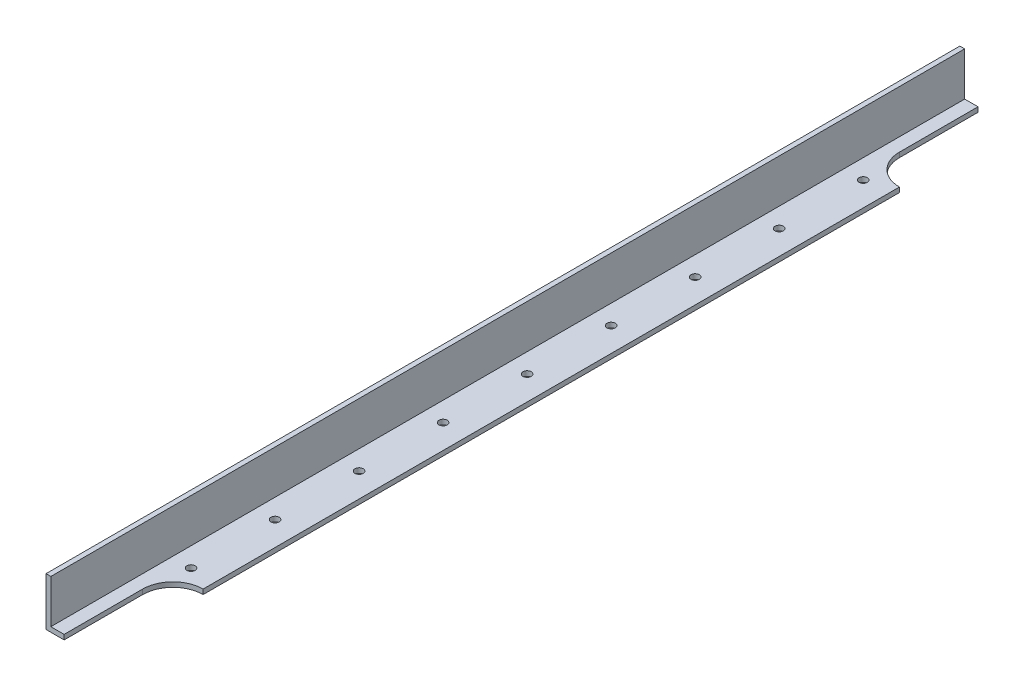
ISO-10303-21;
HEADER;
FILE_DESCRIPTION(('STEP AP214'),'2;1');
FILE_NAME('part.step','',(''),(''),'','','');
FILE_SCHEMA(('AUTOMOTIVE_DESIGN { 1 0 10303 214 1 1 1 1 }'));
ENDSEC;
DATA;
#1=APPLICATION_CONTEXT('core data for automotive mechanical design processes');
#2=APPLICATION_PROTOCOL_DEFINITION('international standard','automotive_design',2000,#1);
#3=PRODUCT_CONTEXT('',#1,'mechanical');
#4=PRODUCT('Part','Part','',(#3));
#5=PRODUCT_RELATED_PRODUCT_CATEGORY('part','',(#4));
#6=PRODUCT_DEFINITION_FORMATION('','',#4);
#7=PRODUCT_DEFINITION_CONTEXT('part definition',#1,'design');
#8=PRODUCT_DEFINITION('design','',#6,#7);
#9=PRODUCT_DEFINITION_SHAPE('','',#8);
#10=(LENGTH_UNIT() NAMED_UNIT(*) SI_UNIT(.MILLI.,.METRE.));
#11=(NAMED_UNIT(*) PLANE_ANGLE_UNIT() SI_UNIT($,.RADIAN.));
#12=(NAMED_UNIT(*) SI_UNIT($,.STERADIAN.) SOLID_ANGLE_UNIT());
#13=UNCERTAINTY_MEASURE_WITH_UNIT(LENGTH_MEASURE(1.E-05),#10,'distance_accuracy_value','');
#14=(GEOMETRIC_REPRESENTATION_CONTEXT(3) GLOBAL_UNCERTAINTY_ASSIGNED_CONTEXT((#13)) GLOBAL_UNIT_ASSIGNED_CONTEXT((#10,
#11,#12)) REPRESENTATION_CONTEXT('',''));
#15=CARTESIAN_POINT('',(0.,0.,0.));
#16=DIRECTION('',(0.,0.,1.));
#17=DIRECTION('',(1.,0.,0.));
#18=AXIS2_PLACEMENT_3D('',#15,#16,#17);
#19=CARTESIAN_POINT('',(0.,0.,378.));
#20=DIRECTION('',(0.,1.,0.));
#21=DIRECTION('',(0.,0.,1.));
#22=AXIS2_PLACEMENT_3D('',#19,#20,#21);
#23=PLANE('',#22);
#24=CARTESIAN_POINT('',(10.,0.,50.));
#25=DIRECTION('',(0.,-1.,0.));
#26=DIRECTION('',(0.,0.,-1.));
#27=AXIS2_PLACEMENT_3D('',#24,#25,#26);
#28=CIRCLE('',#27,1.7);
#29=CARTESIAN_POINT('',(10.,0.,48.3));
#30=VERTEX_POINT('',#29);
#31=EDGE_CURVE('E230',#30,#30,#28,.T.);
#32=ORIENTED_EDGE('',*,*,#31,.F.);
#33=EDGE_LOOP('',(#32));
#34=FACE_BOUND('',#33,.T.);
#35=CARTESIAN_POINT('',(9.99999999999988,0.,84.75));
#36=DIRECTION('',(0.,-1.,0.));
#37=DIRECTION('',(0.,0.,-1.));
#38=AXIS2_PLACEMENT_3D('',#35,#36,#37);
#39=CIRCLE('',#38,1.7);
#40=CARTESIAN_POINT('',(9.99999999999988,0.,83.05));
#41=VERTEX_POINT('',#40);
#42=EDGE_CURVE('E220',#41,#41,#39,.T.);
#43=ORIENTED_EDGE('',*,*,#42,.F.);
#44=EDGE_LOOP('',(#43));
#45=FACE_BOUND('',#44,.T.);
#46=CARTESIAN_POINT('',(9.99999999999976,0.,119.5));
#47=DIRECTION('',(0.,-1.,0.));
#48=DIRECTION('',(0.,0.,-1.));
#49=AXIS2_PLACEMENT_3D('',#46,#47,#48);
#50=CIRCLE('',#49,1.7);
#51=CARTESIAN_POINT('',(9.99999999999976,0.,117.8));
#52=VERTEX_POINT('',#51);
#53=EDGE_CURVE('E217',#52,#52,#50,.T.);
#54=ORIENTED_EDGE('',*,*,#53,.F.);
#55=EDGE_LOOP('',(#54));
#56=FACE_BOUND('',#55,.T.);
#57=CARTESIAN_POINT('',(9.99999999999964,0.,154.25));
#58=DIRECTION('',(0.,-1.,0.));
#59=DIRECTION('',(0.,0.,-1.));
#60=AXIS2_PLACEMENT_3D('',#57,#58,#59);
#61=CIRCLE('',#60,1.7);
#62=CARTESIAN_POINT('',(9.99999999999964,0.,152.55));
#63=VERTEX_POINT('',#62);
#64=EDGE_CURVE('E214',#63,#63,#61,.T.);
#65=ORIENTED_EDGE('',*,*,#64,.F.);
#66=EDGE_LOOP('',(#65));
#67=FACE_BOUND('',#66,.T.);
#68=CARTESIAN_POINT('',(9.99999999999952,0.,189.));
#69=DIRECTION('',(0.,-1.,0.));
#70=DIRECTION('',(0.,0.,-1.));
#71=AXIS2_PLACEMENT_3D('',#68,#69,#70);
#72=CIRCLE('',#71,1.7);
#73=CARTESIAN_POINT('',(9.99999999999952,0.,187.3));
#74=VERTEX_POINT('',#73);
#75=EDGE_CURVE('E210',#74,#74,#72,.T.);
#76=ORIENTED_EDGE('',*,*,#75,.F.);
#77=EDGE_LOOP('',(#76));
#78=FACE_BOUND('',#77,.T.);
#79=CARTESIAN_POINT('',(9.99999999999939,0.,223.75));
#80=DIRECTION('',(0.,-1.,0.));
#81=DIRECTION('',(0.,0.,-1.));
#82=AXIS2_PLACEMENT_3D('',#79,#80,#81);
#83=CIRCLE('',#82,1.7);
#84=CARTESIAN_POINT('',(9.99999999999939,0.,222.05));
#85=VERTEX_POINT('',#84);
#86=EDGE_CURVE('E206',#85,#85,#83,.T.);
#87=ORIENTED_EDGE('',*,*,#86,.F.);
#88=EDGE_LOOP('',(#87));
#89=FACE_BOUND('',#88,.T.);
#90=CARTESIAN_POINT('',(9.99999999999927,0.,258.5));
#91=DIRECTION('',(0.,-1.,0.));
#92=DIRECTION('',(0.,0.,-1.));
#93=AXIS2_PLACEMENT_3D('',#90,#91,#92);
#94=CIRCLE('',#93,1.7);
#95=CARTESIAN_POINT('',(9.99999999999927,0.,256.8));
#96=VERTEX_POINT('',#95);
#97=EDGE_CURVE('E202',#96,#96,#94,.T.);
#98=ORIENTED_EDGE('',*,*,#97,.F.);
#99=EDGE_LOOP('',(#98));
#100=FACE_BOUND('',#99,.T.);
#101=CARTESIAN_POINT('',(9.99999999999915,0.,293.25));
#102=DIRECTION('',(0.,-1.,0.));
#103=DIRECTION('',(0.,0.,-1.));
#104=AXIS2_PLACEMENT_3D('',#101,#102,#103);
#105=CIRCLE('',#104,1.7);
#106=CARTESIAN_POINT('',(9.99999999999915,0.,291.55));
#107=VERTEX_POINT('',#106);
#108=EDGE_CURVE('E198',#107,#107,#105,.T.);
#109=ORIENTED_EDGE('',*,*,#108,.F.);
#110=EDGE_LOOP('',(#109));
#111=FACE_BOUND('',#110,.T.);
#112=CARTESIAN_POINT('',(9.99999999999903,0.,328.));
#113=DIRECTION('',(0.,-1.,0.));
#114=DIRECTION('',(0.,0.,-1.));
#115=AXIS2_PLACEMENT_3D('',#112,#113,#114);
#116=CIRCLE('',#115,1.7);
#117=CARTESIAN_POINT('',(9.99999999999903,0.,326.3));
#118=VERTEX_POINT('',#117);
#119=EDGE_CURVE('E132',#118,#118,#116,.T.);
#120=ORIENTED_EDGE('',*,*,#119,.F.);
#121=EDGE_LOOP('',(#120));
#122=FACE_BOUND('',#121,.T.);
#123=DIRECTION('',(0.,0.,-1.));
#124=VECTOR('',#123,1.);
#125=CARTESIAN_POINT('',(20.,0.,378.));
#126=LINE('',#125,#124);
#127=CARTESIAN_POINT('',(20.,0.,333.));
#128=VERTEX_POINT('',#127);
#129=CARTESIAN_POINT('',(20.,0.,45.));
#130=VERTEX_POINT('',#129);
#131=EDGE_CURVE('E11',#128,#130,#126,.T.);
#132=ORIENTED_EDGE('',*,*,#131,.F.);
#133=CARTESIAN_POINT('',(20.,0.,345.5));
#134=DIRECTION('',(0.,1.,0.));
#135=DIRECTION('',(0.,0.,-1.));
#136=AXIS2_PLACEMENT_3D('',#133,#134,#135);
#137=CIRCLE('',#136,12.5000000000001);
#138=CARTESIAN_POINT('',(7.49999999999995,0.,345.5));
#139=VERTEX_POINT('',#138);
#140=EDGE_CURVE('E114',#128,#139,#137,.T.);
#141=ORIENTED_EDGE('',*,*,#140,.T.);
#142=DIRECTION('',(0.,0.,1.));
#143=VECTOR('',#142,1.);
#144=CARTESIAN_POINT('',(7.49999999999991,0.,378.));
#145=LINE('',#144,#143);
#146=CARTESIAN_POINT('',(7.49999999999991,0.,378.));
#147=VERTEX_POINT('',#146);
#148=EDGE_CURVE('E119',#139,#147,#145,.T.);
#149=ORIENTED_EDGE('',*,*,#148,.T.);
#150=DIRECTION('',(1.,0.,0.));
#151=VECTOR('',#150,1.);
#152=CARTESIAN_POINT('',(0.,0.,378.));
#153=LINE('',#152,#151);
#154=CARTESIAN_POINT('',(0.,0.,378.));
#155=VERTEX_POINT('',#154);
#156=EDGE_CURVE('E157',#155,#147,#153,.T.);
#157=ORIENTED_EDGE('',*,*,#156,.F.);
#158=DIRECTION('',(0.,0.,-1.));
#159=VECTOR('',#158,1.);
#160=CARTESIAN_POINT('',(0.,0.,378.));
#161=LINE('',#160,#159);
#162=CARTESIAN_POINT('',(0.,0.,0.));
#163=VERTEX_POINT('',#162);
#164=EDGE_CURVE('E171',#155,#163,#161,.T.);
#165=ORIENTED_EDGE('',*,*,#164,.T.);
#166=DIRECTION('',(1.,0.,0.));
#167=VECTOR('',#166,1.);
#168=CARTESIAN_POINT('',(0.,0.,0.));
#169=LINE('',#168,#167);
#170=CARTESIAN_POINT('',(7.49999999999991,0.,0.));
#171=VERTEX_POINT('',#170);
#172=EDGE_CURVE('E153',#163,#171,#169,.T.);
#173=ORIENTED_EDGE('',*,*,#172,.T.);
#174=DIRECTION('',(0.,0.,1.));
#175=VECTOR('',#174,1.);
#176=CARTESIAN_POINT('',(7.49999999999991,0.,0.));
#177=LINE('',#176,#175);
#178=CARTESIAN_POINT('',(7.49999999999991,0.,32.4999999999999));
#179=VERTEX_POINT('',#178);
#180=EDGE_CURVE('E58',#171,#179,#177,.T.);
#181=ORIENTED_EDGE('',*,*,#180,.T.);
#182=CARTESIAN_POINT('',(20.,0.,32.4999999999999));
#183=DIRECTION('',(0.,1.,0.));
#184=DIRECTION('',(0.,0.,1.));
#185=AXIS2_PLACEMENT_3D('',#182,#183,#184);
#186=CIRCLE('',#185,12.5000000000001);
#187=EDGE_CURVE('E142',#179,#130,#186,.T.);
#188=ORIENTED_EDGE('',*,*,#187,.T.);
#189=EDGE_LOOP('',(#132,#141,#149,#157,#165,#173,#181,#188));
#190=FACE_BOUND('',#189,.T.);
#191=ADVANCED_FACE('F34',(#34,#45,#56,#67,#78,#89,#100,#111,#122,#190),#23,.F.);
#192=CARTESIAN_POINT('',(20.,2.,378.));
#193=DIRECTION('',(1.,0.,0.));
#194=DIRECTION('',(0.,0.,-1.));
#195=AXIS2_PLACEMENT_3D('',#192,#193,#194);
#196=PLANE('',#195);
#197=DIRECTION('',(0.,1.,0.));
#198=VECTOR('',#197,1.);
#199=CARTESIAN_POINT('',(20.,0.,333.));
#200=LINE('',#199,#198);
#201=CARTESIAN_POINT('',(20.,2.,333.));
#202=VERTEX_POINT('',#201);
#203=EDGE_CURVE('E137',#128,#202,#200,.T.);
#204=ORIENTED_EDGE('',*,*,#203,.F.);
#205=ORIENTED_EDGE('',*,*,#131,.T.);
#206=DIRECTION('',(0.,1.,0.));
#207=VECTOR('',#206,1.);
#208=CARTESIAN_POINT('',(20.,0.,45.));
#209=LINE('',#208,#207);
#210=CARTESIAN_POINT('',(20.,2.,45.));
#211=VERTEX_POINT('',#210);
#212=EDGE_CURVE('E150',#130,#211,#209,.T.);
#213=ORIENTED_EDGE('',*,*,#212,.T.);
#214=DIRECTION('',(0.,0.,-1.));
#215=VECTOR('',#214,1.);
#216=CARTESIAN_POINT('',(20.,2.,378.));
#217=LINE('',#216,#215);
#218=EDGE_CURVE('E42',#202,#211,#217,.T.);
#219=ORIENTED_EDGE('',*,*,#218,.F.);
#220=EDGE_LOOP('',(#204,#205,#213,#219));
#221=FACE_BOUND('',#220,.T.);
#222=ADVANCED_FACE('F247',(#221),#196,.T.);
#223=CARTESIAN_POINT('',(0.,2.,378.));
#224=DIRECTION('',(0.,1.,0.));
#225=DIRECTION('',(0.,0.,1.));
#226=AXIS2_PLACEMENT_3D('',#223,#224,#225);
#227=PLANE('',#226);
#228=CARTESIAN_POINT('',(10.,2.,50.));
#229=DIRECTION('',(0.,1.,0.));
#230=DIRECTION('',(0.,0.,1.));
#231=AXIS2_PLACEMENT_3D('',#228,#229,#230);
#232=CIRCLE('',#231,1.7);
#233=CARTESIAN_POINT('',(10.,2.,51.7));
#234=VERTEX_POINT('',#233);
#235=EDGE_CURVE('E37',#234,#234,#232,.T.);
#236=ORIENTED_EDGE('',*,*,#235,.F.);
#237=EDGE_LOOP('',(#236));
#238=FACE_BOUND('',#237,.T.);
#239=CARTESIAN_POINT('',(9.99999999999988,2.,84.75));
#240=DIRECTION('',(0.,1.,0.));
#241=DIRECTION('',(0.,0.,1.));
#242=AXIS2_PLACEMENT_3D('',#239,#240,#241);
#243=CIRCLE('',#242,1.7);
#244=CARTESIAN_POINT('',(9.99999999999988,2.,86.45));
#245=VERTEX_POINT('',#244);
#246=EDGE_CURVE('E218',#245,#245,#243,.T.);
#247=ORIENTED_EDGE('',*,*,#246,.F.);
#248=EDGE_LOOP('',(#247));
#249=FACE_BOUND('',#248,.T.);
#250=CARTESIAN_POINT('',(9.99999999999976,2.,119.5));
#251=DIRECTION('',(0.,1.,0.));
#252=DIRECTION('',(0.,0.,1.));
#253=AXIS2_PLACEMENT_3D('',#250,#251,#252);
#254=CIRCLE('',#253,1.7);
#255=CARTESIAN_POINT('',(9.99999999999976,2.,121.2));
#256=VERTEX_POINT('',#255);
#257=EDGE_CURVE('E215',#256,#256,#254,.T.);
#258=ORIENTED_EDGE('',*,*,#257,.F.);
#259=EDGE_LOOP('',(#258));
#260=FACE_BOUND('',#259,.T.);
#261=CARTESIAN_POINT('',(9.99999999999964,2.,154.25));
#262=DIRECTION('',(0.,1.,0.));
#263=DIRECTION('',(0.,0.,1.));
#264=AXIS2_PLACEMENT_3D('',#261,#262,#263);
#265=CIRCLE('',#264,1.7);
#266=CARTESIAN_POINT('',(9.99999999999964,2.,155.95));
#267=VERTEX_POINT('',#266);
#268=EDGE_CURVE('E211',#267,#267,#265,.T.);
#269=ORIENTED_EDGE('',*,*,#268,.F.);
#270=EDGE_LOOP('',(#269));
#271=FACE_BOUND('',#270,.T.);
#272=CARTESIAN_POINT('',(9.99999999999952,2.,189.));
#273=DIRECTION('',(0.,1.,0.));
#274=DIRECTION('',(0.,0.,1.));
#275=AXIS2_PLACEMENT_3D('',#272,#273,#274);
#276=CIRCLE('',#275,1.7);
#277=CARTESIAN_POINT('',(9.99999999999952,2.,190.7));
#278=VERTEX_POINT('',#277);
#279=EDGE_CURVE('E207',#278,#278,#276,.T.);
#280=ORIENTED_EDGE('',*,*,#279,.F.);
#281=EDGE_LOOP('',(#280));
#282=FACE_BOUND('',#281,.T.);
#283=CARTESIAN_POINT('',(9.99999999999939,2.,223.75));
#284=DIRECTION('',(0.,1.,0.));
#285=DIRECTION('',(0.,0.,1.));
#286=AXIS2_PLACEMENT_3D('',#283,#284,#285);
#287=CIRCLE('',#286,1.7);
#288=CARTESIAN_POINT('',(9.99999999999939,2.,225.45));
#289=VERTEX_POINT('',#288);
#290=EDGE_CURVE('E203',#289,#289,#287,.T.);
#291=ORIENTED_EDGE('',*,*,#290,.F.);
#292=EDGE_LOOP('',(#291));
#293=FACE_BOUND('',#292,.T.);
#294=CARTESIAN_POINT('',(9.99999999999927,2.,258.5));
#295=DIRECTION('',(0.,1.,0.));
#296=DIRECTION('',(0.,0.,1.));
#297=AXIS2_PLACEMENT_3D('',#294,#295,#296);
#298=CIRCLE('',#297,1.7);
#299=CARTESIAN_POINT('',(9.99999999999927,2.,260.2));
#300=VERTEX_POINT('',#299);
#301=EDGE_CURVE('E199',#300,#300,#298,.T.);
#302=ORIENTED_EDGE('',*,*,#301,.F.);
#303=EDGE_LOOP('',(#302));
#304=FACE_BOUND('',#303,.T.);
#305=CARTESIAN_POINT('',(9.99999999999915,2.,293.25));
#306=DIRECTION('',(0.,1.,0.));
#307=DIRECTION('',(0.,0.,1.));
#308=AXIS2_PLACEMENT_3D('',#305,#306,#307);
#309=CIRCLE('',#308,1.7);
#310=CARTESIAN_POINT('',(9.99999999999915,2.,294.95));
#311=VERTEX_POINT('',#310);
#312=EDGE_CURVE('E195',#311,#311,#309,.T.);
#313=ORIENTED_EDGE('',*,*,#312,.F.);
#314=EDGE_LOOP('',(#313));
#315=FACE_BOUND('',#314,.T.);
#316=CARTESIAN_POINT('',(9.99999999999903,2.,328.));
#317=DIRECTION('',(0.,1.,0.));
#318=DIRECTION('',(0.,0.,1.));
#319=AXIS2_PLACEMENT_3D('',#316,#317,#318);
#320=CIRCLE('',#319,1.7);
#321=CARTESIAN_POINT('',(9.99999999999903,2.,329.7));
#322=VERTEX_POINT('',#321);
#323=EDGE_CURVE('E135',#322,#322,#320,.T.);
#324=ORIENTED_EDGE('',*,*,#323,.F.);
#325=EDGE_LOOP('',(#324));
#326=FACE_BOUND('',#325,.T.);
#327=CARTESIAN_POINT('',(20.,2.,345.5));
#328=DIRECTION('',(0.,1.,0.));
#329=DIRECTION('',(0.,0.,-1.));
#330=AXIS2_PLACEMENT_3D('',#327,#328,#329);
#331=CIRCLE('',#330,12.5000000000001);
#332=CARTESIAN_POINT('',(7.49999999999995,2.,345.5));
#333=VERTEX_POINT('',#332);
#334=EDGE_CURVE('E117',#202,#333,#331,.T.);
#335=ORIENTED_EDGE('',*,*,#334,.F.);
#336=ORIENTED_EDGE('',*,*,#218,.T.);
#337=CARTESIAN_POINT('',(20.,2.,32.4999999999999));
#338=DIRECTION('',(0.,1.,0.));
#339=DIRECTION('',(0.,0.,1.));
#340=AXIS2_PLACEMENT_3D('',#337,#338,#339);
#341=CIRCLE('',#340,12.5000000000001);
#342=CARTESIAN_POINT('',(7.49999999999991,2.,32.4999999999999));
#343=VERTEX_POINT('',#342);
#344=EDGE_CURVE('E143',#343,#211,#341,.T.);
#345=ORIENTED_EDGE('',*,*,#344,.F.);
#346=DIRECTION('',(0.,0.,1.));
#347=VECTOR('',#346,1.);
#348=CARTESIAN_POINT('',(7.49999999999991,2.,0.));
#349=LINE('',#348,#347);
#350=CARTESIAN_POINT('',(7.49999999999991,2.,0.));
#351=VERTEX_POINT('',#350);
#352=EDGE_CURVE('E139',#351,#343,#349,.T.);
#353=ORIENTED_EDGE('',*,*,#352,.F.);
#354=DIRECTION('',(1.,0.,0.));
#355=VECTOR('',#354,1.);
#356=CARTESIAN_POINT('',(0.,2.,0.));
#357=LINE('',#356,#355);
#358=CARTESIAN_POINT('',(2.,2.,0.));
#359=VERTEX_POINT('',#358);
#360=EDGE_CURVE('E174',#359,#351,#357,.T.);
#361=ORIENTED_EDGE('',*,*,#360,.F.);
#362=DIRECTION('',(0.,0.,-1.));
#363=VECTOR('',#362,1.);
#364=CARTESIAN_POINT('',(2.,2.,378.));
#365=LINE('',#364,#363);
#366=CARTESIAN_POINT('',(2.,2.,378.));
#367=VERTEX_POINT('',#366);
#368=EDGE_CURVE('E190',#367,#359,#365,.T.);
#369=ORIENTED_EDGE('',*,*,#368,.F.);
#370=DIRECTION('',(1.,0.,0.));
#371=VECTOR('',#370,1.);
#372=CARTESIAN_POINT('',(0.,2.,378.));
#373=LINE('',#372,#371);
#374=CARTESIAN_POINT('',(7.49999999999991,2.,378.));
#375=VERTEX_POINT('',#374);
#376=EDGE_CURVE('E159',#367,#375,#373,.T.);
#377=ORIENTED_EDGE('',*,*,#376,.T.);
#378=DIRECTION('',(0.,0.,1.));
#379=VECTOR('',#378,1.);
#380=CARTESIAN_POINT('',(7.49999999999991,2.,378.));
#381=LINE('',#380,#379);
#382=EDGE_CURVE('E50',#333,#375,#381,.T.);
#383=ORIENTED_EDGE('',*,*,#382,.F.);
#384=EDGE_LOOP('',(#335,#336,#345,#353,#361,#369,#377,#383));
#385=FACE_BOUND('',#384,.T.);
#386=ADVANCED_FACE('F294',(#238,#249,#260,#271,#282,#293,#304,#315,#326,#385),#227,.T.);
#387=CARTESIAN_POINT('',(2.,0.,378.));
#388=DIRECTION('',(1.,0.,0.));
#389=DIRECTION('',(0.,0.,-1.));
#390=AXIS2_PLACEMENT_3D('',#387,#388,#389);
#391=PLANE('',#390);
#392=DIRECTION('',(0.,1.,0.));
#393=VECTOR('',#392,1.);
#394=CARTESIAN_POINT('',(2.,0.,0.));
#395=LINE('',#394,#393);
#396=CARTESIAN_POINT('',(2.,20.,0.));
#397=VERTEX_POINT('',#396);
#398=EDGE_CURVE('E177',#397,#359,#395,.F.);
#399=ORIENTED_EDGE('',*,*,#398,.F.);
#400=DIRECTION('',(0.,0.,-1.));
#401=VECTOR('',#400,1.);
#402=CARTESIAN_POINT('',(2.,20.,378.));
#403=LINE('',#402,#401);
#404=CARTESIAN_POINT('',(2.,20.,378.));
#405=VERTEX_POINT('',#404);
#406=EDGE_CURVE('E188',#405,#397,#403,.T.);
#407=ORIENTED_EDGE('',*,*,#406,.F.);
#408=DIRECTION('',(0.,1.,0.));
#409=VECTOR('',#408,1.);
#410=CARTESIAN_POINT('',(2.,0.,378.));
#411=LINE('',#410,#409);
#412=EDGE_CURVE('E163',#405,#367,#411,.F.);
#413=ORIENTED_EDGE('',*,*,#412,.T.);
#414=ORIENTED_EDGE('',*,*,#368,.T.);
#415=EDGE_LOOP('',(#399,#407,#413,#414));
#416=FACE_BOUND('',#415,.T.);
#417=ADVANCED_FACE('F290',(#416),#391,.T.);
#418=CARTESIAN_POINT('',(0.,20.,378.));
#419=DIRECTION('',(0.,1.,0.));
#420=DIRECTION('',(0.,0.,1.));
#421=AXIS2_PLACEMENT_3D('',#418,#419,#420);
#422=PLANE('',#421);
#423=DIRECTION('',(1.,0.,0.));
#424=VECTOR('',#423,1.);
#425=CARTESIAN_POINT('',(0.,20.,0.));
#426=LINE('',#425,#424);
#427=CARTESIAN_POINT('',(0.,20.,0.));
#428=VERTEX_POINT('',#427);
#429=EDGE_CURVE('E180',#428,#397,#426,.T.);
#430=ORIENTED_EDGE('',*,*,#429,.F.);
#431=DIRECTION('',(0.,0.,-1.));
#432=VECTOR('',#431,1.);
#433=CARTESIAN_POINT('',(0.,20.,378.));
#434=LINE('',#433,#432);
#435=CARTESIAN_POINT('',(0.,20.,378.));
#436=VERTEX_POINT('',#435);
#437=EDGE_CURVE('E186',#436,#428,#434,.T.);
#438=ORIENTED_EDGE('',*,*,#437,.F.);
#439=DIRECTION('',(1.,0.,0.));
#440=VECTOR('',#439,1.);
#441=CARTESIAN_POINT('',(0.,20.,378.));
#442=LINE('',#441,#440);
#443=EDGE_CURVE('E166',#436,#405,#442,.T.);
#444=ORIENTED_EDGE('',*,*,#443,.T.);
#445=ORIENTED_EDGE('',*,*,#406,.T.);
#446=EDGE_LOOP('',(#430,#438,#444,#445));
#447=FACE_BOUND('',#446,.T.);
#448=ADVANCED_FACE('F286',(#447),#422,.T.);
#449=CARTESIAN_POINT('',(0.,0.,378.));
#450=DIRECTION('',(1.,0.,0.));
#451=DIRECTION('',(0.,0.,-1.));
#452=AXIS2_PLACEMENT_3D('',#449,#450,#451);
#453=PLANE('',#452);
#454=DIRECTION('',(0.,-1.,0.));
#455=VECTOR('',#454,1.);
#456=CARTESIAN_POINT('',(0.,0.,0.));
#457=LINE('',#456,#455);
#458=EDGE_CURVE('E160',#428,#163,#457,.T.);
#459=ORIENTED_EDGE('',*,*,#458,.T.);
#460=ORIENTED_EDGE('',*,*,#164,.F.);
#461=DIRECTION('',(0.,-1.,0.));
#462=VECTOR('',#461,1.);
#463=CARTESIAN_POINT('',(0.,0.,378.));
#464=LINE('',#463,#462);
#465=EDGE_CURVE('E169',#436,#155,#464,.T.);
#466=ORIENTED_EDGE('',*,*,#465,.F.);
#467=ORIENTED_EDGE('',*,*,#437,.T.);
#468=EDGE_LOOP('',(#459,#460,#466,#467));
#469=FACE_BOUND('',#468,.T.);
#470=ADVANCED_FACE('F279',(#469),#453,.F.);
#471=CARTESIAN_POINT('',(20.,0.,378.));
#472=DIRECTION('',(0.,0.,-1.));
#473=DIRECTION('',(-1.,0.,0.));
#474=AXIS2_PLACEMENT_3D('',#471,#472,#473);
#475=PLANE('',#474);
#476=ORIENTED_EDGE('',*,*,#156,.T.);
#477=DIRECTION('',(0.,1.,0.));
#478=VECTOR('',#477,1.);
#479=CARTESIAN_POINT('',(7.49999999999991,0.,378.));
#480=LINE('',#479,#478);
#481=EDGE_CURVE('E118',#147,#375,#480,.T.);
#482=ORIENTED_EDGE('',*,*,#481,.T.);
#483=ORIENTED_EDGE('',*,*,#376,.F.);
#484=ORIENTED_EDGE('',*,*,#412,.F.);
#485=ORIENTED_EDGE('',*,*,#443,.F.);
#486=ORIENTED_EDGE('',*,*,#465,.T.);
#487=EDGE_LOOP('',(#476,#482,#483,#484,#485,#486));
#488=FACE_BOUND('',#487,.T.);
#489=ADVANCED_FACE('F276',(#488),#475,.F.);
#490=CARTESIAN_POINT('',(20.,0.,0.));
#491=DIRECTION('',(0.,0.,-1.));
#492=DIRECTION('',(-1.,0.,0.));
#493=AXIS2_PLACEMENT_3D('',#490,#491,#492);
#494=PLANE('',#493);
#495=DIRECTION('',(0.,1.,0.));
#496=VECTOR('',#495,1.);
#497=CARTESIAN_POINT('',(7.49999999999991,0.,0.));
#498=LINE('',#497,#496);
#499=EDGE_CURVE('E145',#171,#351,#498,.T.);
#500=ORIENTED_EDGE('',*,*,#499,.F.);
#501=ORIENTED_EDGE('',*,*,#172,.F.);
#502=ORIENTED_EDGE('',*,*,#458,.F.);
#503=ORIENTED_EDGE('',*,*,#429,.T.);
#504=ORIENTED_EDGE('',*,*,#398,.T.);
#505=ORIENTED_EDGE('',*,*,#360,.T.);
#506=EDGE_LOOP('',(#500,#501,#502,#503,#504,#505));
#507=FACE_BOUND('',#506,.T.);
#508=ADVANCED_FACE('F272',(#507),#494,.T.);
#509=CARTESIAN_POINT('',(20.,0.,32.4999999999999));
#510=DIRECTION('',(0.,1.,0.));
#511=DIRECTION('',(0.,0.,1.));
#512=AXIS2_PLACEMENT_3D('',#509,#510,#511);
#513=CYLINDRICAL_SURFACE('',#512,12.5000000000001);
#514=ORIENTED_EDGE('',*,*,#344,.T.);
#515=ORIENTED_EDGE('',*,*,#212,.F.);
#516=ORIENTED_EDGE('',*,*,#187,.F.);
#517=DIRECTION('',(0.,1.,0.));
#518=VECTOR('',#517,1.);
#519=CARTESIAN_POINT('',(7.49999999999991,0.,32.4999999999999));
#520=LINE('',#519,#518);
#521=EDGE_CURVE('E154',#179,#343,#520,.T.);
#522=ORIENTED_EDGE('',*,*,#521,.T.);
#523=EDGE_LOOP('',(#514,#515,#516,#522));
#524=FACE_BOUND('',#523,.T.);
#525=ADVANCED_FACE('F269',(#524),#513,.F.);
#526=CARTESIAN_POINT('',(7.49999999999991,0.,0.));
#527=DIRECTION('',(-1.,0.,0.));
#528=DIRECTION('',(0.,0.,1.));
#529=AXIS2_PLACEMENT_3D('',#526,#527,#528);
#530=PLANE('',#529);
#531=ORIENTED_EDGE('',*,*,#352,.T.);
#532=ORIENTED_EDGE('',*,*,#521,.F.);
#533=ORIENTED_EDGE('',*,*,#180,.F.);
#534=ORIENTED_EDGE('',*,*,#499,.T.);
#535=EDGE_LOOP('',(#531,#532,#533,#534));
#536=FACE_BOUND('',#535,.T.);
#537=ADVANCED_FACE('F268',(#536),#530,.F.);
#538=CARTESIAN_POINT('',(20.,0.,345.5));
#539=DIRECTION('',(0.,1.,0.));
#540=DIRECTION('',(0.,0.,1.));
#541=AXIS2_PLACEMENT_3D('',#538,#539,#540);
#542=CYLINDRICAL_SURFACE('',#541,12.5000000000001);
#543=ORIENTED_EDGE('',*,*,#334,.T.);
#544=DIRECTION('',(0.,1.,0.));
#545=VECTOR('',#544,1.);
#546=CARTESIAN_POINT('',(7.49999999999995,0.,345.5));
#547=LINE('',#546,#545);
#548=EDGE_CURVE('E110',#139,#333,#547,.T.);
#549=ORIENTED_EDGE('',*,*,#548,.F.);
#550=ORIENTED_EDGE('',*,*,#140,.F.);
#551=ORIENTED_EDGE('',*,*,#203,.T.);
#552=EDGE_LOOP('',(#543,#549,#550,#551));
#553=FACE_BOUND('',#552,.T.);
#554=ADVANCED_FACE('F112',(#553),#542,.F.);
#555=CARTESIAN_POINT('',(7.49999999999991,0.,378.));
#556=DIRECTION('',(-1.,0.,0.));
#557=DIRECTION('',(0.,0.,1.));
#558=AXIS2_PLACEMENT_3D('',#555,#556,#557);
#559=PLANE('',#558);
#560=ORIENTED_EDGE('',*,*,#382,.T.);
#561=ORIENTED_EDGE('',*,*,#481,.F.);
#562=ORIENTED_EDGE('',*,*,#148,.F.);
#563=ORIENTED_EDGE('',*,*,#548,.T.);
#564=EDGE_LOOP('',(#560,#561,#562,#563));
#565=FACE_BOUND('',#564,.T.);
#566=ADVANCED_FACE('F122',(#565),#559,.F.);
#567=CARTESIAN_POINT('',(9.99999999999903,0.,328.));
#568=DIRECTION('',(0.,-1.,0.));
#569=DIRECTION('',(0.,0.,-1.));
#570=AXIS2_PLACEMENT_3D('',#567,#568,#569);
#571=CYLINDRICAL_SURFACE('',#570,1.7);
#572=ORIENTED_EDGE('',*,*,#323,.T.);
#573=EDGE_LOOP('',(#572));
#574=FACE_BOUND('',#573,.T.);
#575=ORIENTED_EDGE('',*,*,#119,.T.);
#576=EDGE_LOOP('',(#575));
#577=FACE_BOUND('',#576,.T.);
#578=ADVANCED_FACE('F252',(#574,#577),#571,.F.);
#579=CARTESIAN_POINT('',(9.99999999999915,0.,293.25));
#580=DIRECTION('',(0.,-1.,0.));
#581=DIRECTION('',(0.,0.,-1.));
#582=AXIS2_PLACEMENT_3D('',#579,#580,#581);
#583=CYLINDRICAL_SURFACE('',#582,1.7);
#584=ORIENTED_EDGE('',*,*,#312,.T.);
#585=EDGE_LOOP('',(#584));
#586=FACE_BOUND('',#585,.T.);
#587=ORIENTED_EDGE('',*,*,#108,.T.);
#588=EDGE_LOOP('',(#587));
#589=FACE_BOUND('',#588,.T.);
#590=ADVANCED_FACE('F243',(#586,#589),#583,.F.);
#591=CARTESIAN_POINT('',(9.99999999999927,0.,258.5));
#592=DIRECTION('',(0.,-1.,0.));
#593=DIRECTION('',(0.,0.,-1.));
#594=AXIS2_PLACEMENT_3D('',#591,#592,#593);
#595=CYLINDRICAL_SURFACE('',#594,1.7);
#596=ORIENTED_EDGE('',*,*,#301,.T.);
#597=EDGE_LOOP('',(#596));
#598=FACE_BOUND('',#597,.T.);
#599=ORIENTED_EDGE('',*,*,#97,.T.);
#600=EDGE_LOOP('',(#599));
#601=FACE_BOUND('',#600,.T.);
#602=ADVANCED_FACE('F260',(#598,#601),#595,.F.);
#603=CARTESIAN_POINT('',(9.99999999999939,0.,223.75));
#604=DIRECTION('',(0.,-1.,0.));
#605=DIRECTION('',(0.,0.,-1.));
#606=AXIS2_PLACEMENT_3D('',#603,#604,#605);
#607=CYLINDRICAL_SURFACE('',#606,1.7);
#608=ORIENTED_EDGE('',*,*,#290,.T.);
#609=EDGE_LOOP('',(#608));
#610=FACE_BOUND('',#609,.T.);
#611=ORIENTED_EDGE('',*,*,#86,.T.);
#612=EDGE_LOOP('',(#611));
#613=FACE_BOUND('',#612,.T.);
#614=ADVANCED_FACE('F403',(#610,#613),#607,.F.);
#615=CARTESIAN_POINT('',(9.99999999999952,0.,189.));
#616=DIRECTION('',(0.,-1.,0.));
#617=DIRECTION('',(0.,0.,-1.));
#618=AXIS2_PLACEMENT_3D('',#615,#616,#617);
#619=CYLINDRICAL_SURFACE('',#618,1.7);
#620=ORIENTED_EDGE('',*,*,#279,.T.);
#621=EDGE_LOOP('',(#620));
#622=FACE_BOUND('',#621,.T.);
#623=ORIENTED_EDGE('',*,*,#75,.T.);
#624=EDGE_LOOP('',(#623));
#625=FACE_BOUND('',#624,.T.);
#626=ADVANCED_FACE('F411',(#622,#625),#619,.F.);
#627=CARTESIAN_POINT('',(9.99999999999964,0.,154.25));
#628=DIRECTION('',(0.,-1.,0.));
#629=DIRECTION('',(0.,0.,-1.));
#630=AXIS2_PLACEMENT_3D('',#627,#628,#629);
#631=CYLINDRICAL_SURFACE('',#630,1.7);
#632=ORIENTED_EDGE('',*,*,#268,.T.);
#633=EDGE_LOOP('',(#632));
#634=FACE_BOUND('',#633,.T.);
#635=ORIENTED_EDGE('',*,*,#64,.T.);
#636=EDGE_LOOP('',(#635));
#637=FACE_BOUND('',#636,.T.);
#638=ADVANCED_FACE('F420',(#634,#637),#631,.F.);
#639=CARTESIAN_POINT('',(9.99999999999976,0.,119.5));
#640=DIRECTION('',(0.,-1.,0.));
#641=DIRECTION('',(0.,0.,-1.));
#642=AXIS2_PLACEMENT_3D('',#639,#640,#641);
#643=CYLINDRICAL_SURFACE('',#642,1.7);
#644=ORIENTED_EDGE('',*,*,#257,.T.);
#645=EDGE_LOOP('',(#644));
#646=FACE_BOUND('',#645,.T.);
#647=ORIENTED_EDGE('',*,*,#53,.T.);
#648=EDGE_LOOP('',(#647));
#649=FACE_BOUND('',#648,.T.);
#650=ADVANCED_FACE('F429',(#646,#649),#643,.F.);
#651=CARTESIAN_POINT('',(9.99999999999988,0.,84.75));
#652=DIRECTION('',(0.,-1.,0.));
#653=DIRECTION('',(0.,0.,-1.));
#654=AXIS2_PLACEMENT_3D('',#651,#652,#653);
#655=CYLINDRICAL_SURFACE('',#654,1.7);
#656=ORIENTED_EDGE('',*,*,#246,.T.);
#657=EDGE_LOOP('',(#656));
#658=FACE_BOUND('',#657,.T.);
#659=ORIENTED_EDGE('',*,*,#42,.T.);
#660=EDGE_LOOP('',(#659));
#661=FACE_BOUND('',#660,.T.);
#662=ADVANCED_FACE('F438',(#658,#661),#655,.F.);
#663=CARTESIAN_POINT('',(10.,0.,50.));
#664=DIRECTION('',(0.,-1.,0.));
#665=DIRECTION('',(0.,0.,-1.));
#666=AXIS2_PLACEMENT_3D('',#663,#664,#665);
#667=CYLINDRICAL_SURFACE('',#666,1.7);
#668=ORIENTED_EDGE('',*,*,#235,.T.);
#669=EDGE_LOOP('',(#668));
#670=FACE_BOUND('',#669,.T.);
#671=ORIENTED_EDGE('',*,*,#31,.T.);
#672=EDGE_LOOP('',(#671));
#673=FACE_BOUND('',#672,.T.);
#674=ADVANCED_FACE('F447',(#670,#673),#667,.F.);
#675=CLOSED_SHELL('',(#191,#222,#386,#417,#448,#470,#489,#508,#525,#537,#554,#566,#578,#590,
#602,#614,#626,#638,#650,#662,#674));
#676=MANIFOLD_SOLID_BREP('B2',#675);
#677=ADVANCED_BREP_SHAPE_REPRESENTATION('',(#18,#676),#14);
#678=SHAPE_DEFINITION_REPRESENTATION(#9,#677);
ENDSEC;
END-ISO-10303-21;
